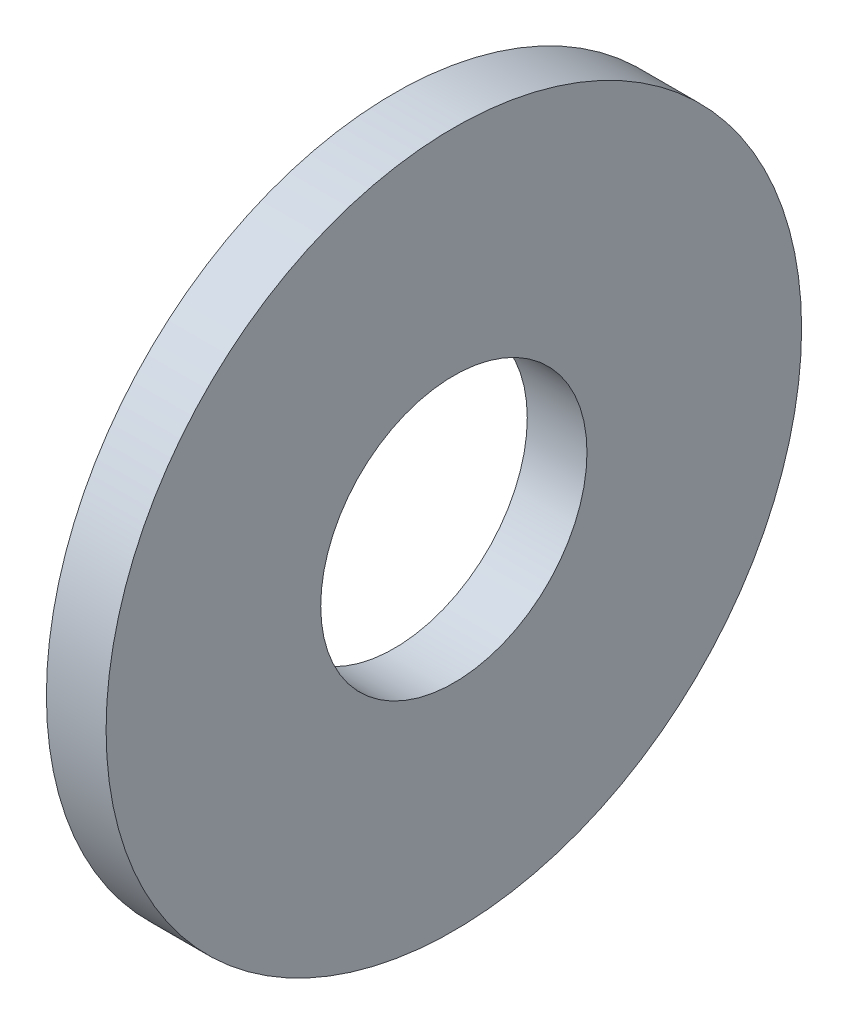
ISO-10303-21;
HEADER;
FILE_DESCRIPTION(('STEP AP214'),'2;1');
FILE_NAME('part.step','',(''),(''),'','','');
FILE_SCHEMA(('AUTOMOTIVE_DESIGN { 1 0 10303 214 1 1 1 1 }'));
ENDSEC;
DATA;
#1=APPLICATION_CONTEXT('core data for automotive mechanical design processes');
#2=APPLICATION_PROTOCOL_DEFINITION('international standard','automotive_design',2000,#1);
#3=PRODUCT_CONTEXT('',#1,'mechanical');
#4=PRODUCT('Part','Part','',(#3));
#5=PRODUCT_RELATED_PRODUCT_CATEGORY('part','',(#4));
#6=PRODUCT_DEFINITION_FORMATION('','',#4);
#7=PRODUCT_DEFINITION_CONTEXT('part definition',#1,'design');
#8=PRODUCT_DEFINITION('design','',#6,#7);
#9=PRODUCT_DEFINITION_SHAPE('','',#8);
#10=(LENGTH_UNIT() NAMED_UNIT(*) SI_UNIT(.MILLI.,.METRE.));
#11=(NAMED_UNIT(*) PLANE_ANGLE_UNIT() SI_UNIT($,.RADIAN.));
#12=(NAMED_UNIT(*) SI_UNIT($,.STERADIAN.) SOLID_ANGLE_UNIT());
#13=UNCERTAINTY_MEASURE_WITH_UNIT(LENGTH_MEASURE(1.E-05),#10,'distance_accuracy_value','');
#14=(GEOMETRIC_REPRESENTATION_CONTEXT(3) GLOBAL_UNCERTAINTY_ASSIGNED_CONTEXT((#13)) GLOBAL_UNIT_ASSIGNED_CONTEXT((#10,
#11,#12)) REPRESENTATION_CONTEXT('',''));
#15=CARTESIAN_POINT('',(0.,0.,0.));
#16=DIRECTION('',(0.,0.,1.));
#17=DIRECTION('',(1.,0.,0.));
#18=AXIS2_PLACEMENT_3D('',#15,#16,#17);
#19=CARTESIAN_POINT('',(1.6002,0.,0.));
#20=DIRECTION('',(-1.,0.,0.));
#21=DIRECTION('',(0.,0.,1.));
#22=AXIS2_PLACEMENT_3D('',#19,#20,#21);
#23=CYLINDRICAL_SURFACE('',#22,3.5687);
#24=CARTESIAN_POINT('',(1.6002,0.,0.));
#25=DIRECTION('',(1.,0.,0.));
#26=DIRECTION('',(0.,0.,-1.));
#27=AXIS2_PLACEMENT_3D('',#24,#25,#26);
#28=CIRCLE('',#27,3.5687);
#29=CARTESIAN_POINT('',(1.6002,0.,-3.5687));
#30=VERTEX_POINT('',#29);
#31=EDGE_CURVE('E37',#30,#30,#28,.T.);
#32=ORIENTED_EDGE('',*,*,#31,.T.);
#33=EDGE_LOOP('',(#32));
#34=FACE_BOUND('',#33,.T.);
#35=CARTESIAN_POINT('',(0.,0.,0.));
#36=DIRECTION('',(1.,0.,0.));
#37=DIRECTION('',(0.,0.,-1.));
#38=AXIS2_PLACEMENT_3D('',#35,#36,#37);
#39=CIRCLE('',#38,3.5687);
#40=CARTESIAN_POINT('',(0.,0.,-3.5687));
#41=VERTEX_POINT('',#40);
#42=EDGE_CURVE('E43',#41,#41,#39,.T.);
#43=ORIENTED_EDGE('',*,*,#42,.F.);
#44=EDGE_LOOP('',(#43));
#45=FACE_BOUND('',#44,.T.);
#46=ADVANCED_FACE('F30',(#34,#45),#23,.F.);
#47=CARTESIAN_POINT('',(1.6002,0.,0.));
#48=DIRECTION('',(-1.,0.,0.));
#49=DIRECTION('',(0.,0.,1.));
#50=AXIS2_PLACEMENT_3D('',#47,#48,#49);
#51=CYLINDRICAL_SURFACE('',#50,9.3218);
#52=CARTESIAN_POINT('',(1.6002,0.,0.));
#53=DIRECTION('',(1.,0.,0.));
#54=DIRECTION('',(0.,0.,-1.));
#55=AXIS2_PLACEMENT_3D('',#52,#53,#54);
#56=CIRCLE('',#55,9.3218);
#57=CARTESIAN_POINT('',(1.6002,0.,-9.3218));
#58=VERTEX_POINT('',#57);
#59=EDGE_CURVE('E10',#58,#58,#56,.T.);
#60=ORIENTED_EDGE('',*,*,#59,.F.);
#61=EDGE_LOOP('',(#60));
#62=FACE_BOUND('',#61,.T.);
#63=CARTESIAN_POINT('',(0.,0.,0.));
#64=DIRECTION('',(1.,0.,0.));
#65=DIRECTION('',(0.,0.,-1.));
#66=AXIS2_PLACEMENT_3D('',#63,#64,#65);
#67=CIRCLE('',#66,9.3218);
#68=CARTESIAN_POINT('',(0.,0.,-9.3218));
#69=VERTEX_POINT('',#68);
#70=EDGE_CURVE('E33',#69,#69,#67,.T.);
#71=ORIENTED_EDGE('',*,*,#70,.T.);
#72=EDGE_LOOP('',(#71));
#73=FACE_BOUND('',#72,.T.);
#74=ADVANCED_FACE('F50',(#62,#73),#51,.T.);
#75=CARTESIAN_POINT('',(1.6002,0.,0.));
#76=DIRECTION('',(1.,0.,0.));
#77=DIRECTION('',(0.,0.,-1.));
#78=AXIS2_PLACEMENT_3D('',#75,#76,#77);
#79=PLANE('',#78);
#80=ORIENTED_EDGE('',*,*,#31,.F.);
#81=EDGE_LOOP('',(#80));
#82=FACE_BOUND('',#81,.T.);
#83=ORIENTED_EDGE('',*,*,#59,.T.);
#84=EDGE_LOOP('',(#83));
#85=FACE_BOUND('',#84,.T.);
#86=ADVANCED_FACE('F54',(#82,#85),#79,.T.);
#87=CARTESIAN_POINT('',(0.,0.,0.));
#88=DIRECTION('',(1.,0.,0.));
#89=DIRECTION('',(0.,0.,-1.));
#90=AXIS2_PLACEMENT_3D('',#87,#88,#89);
#91=PLANE('',#90);
#92=ORIENTED_EDGE('',*,*,#42,.T.);
#93=EDGE_LOOP('',(#92));
#94=FACE_BOUND('',#93,.T.);
#95=ORIENTED_EDGE('',*,*,#70,.F.);
#96=EDGE_LOOP('',(#95));
#97=FACE_BOUND('',#96,.T.);
#98=ADVANCED_FACE('F52',(#94,#97),#91,.F.);
#99=CLOSED_SHELL('',(#46,#74,#86,#98));
#100=MANIFOLD_SOLID_BREP('B2',#99);
#101=ADVANCED_BREP_SHAPE_REPRESENTATION('',(#18,#100),#14);
#102=SHAPE_DEFINITION_REPRESENTATION(#9,#101);
ENDSEC;
END-ISO-10303-21;
